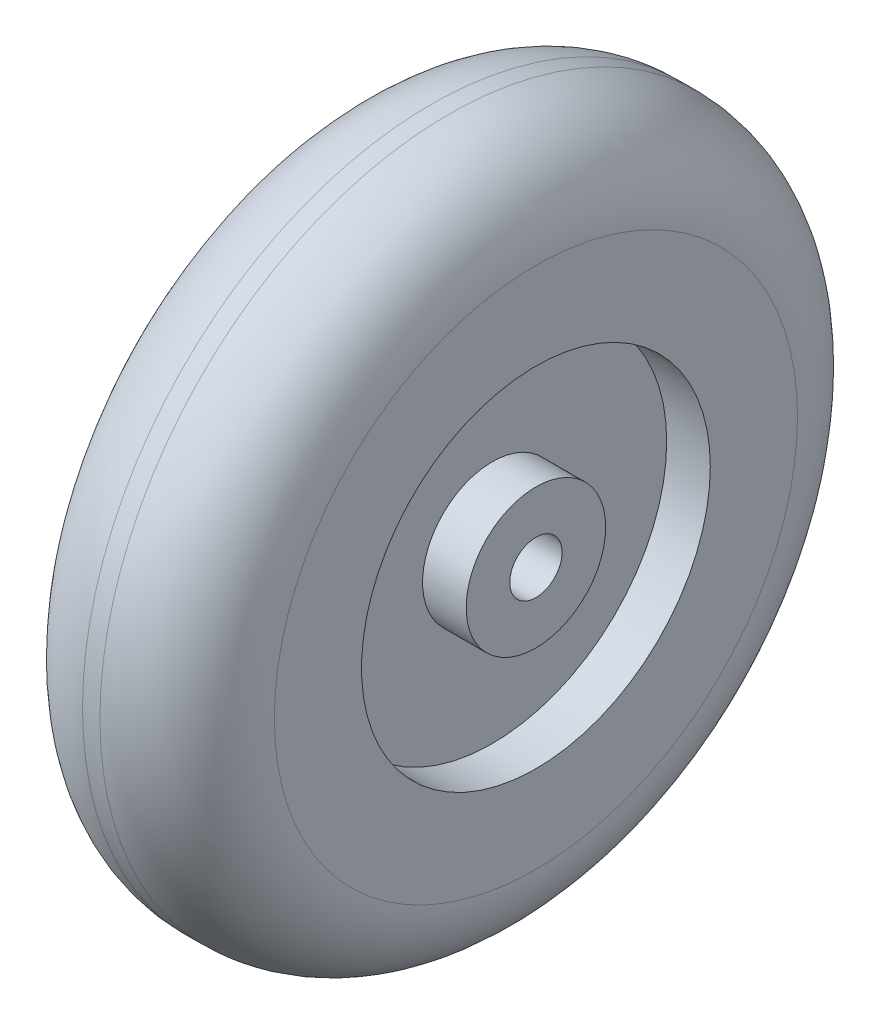
ISO-10303-21;
HEADER;
FILE_DESCRIPTION(('STEP AP214'),'2;1');
FILE_NAME('part.step','',(''),(''),'','','');
FILE_SCHEMA(('AUTOMOTIVE_DESIGN { 1 0 10303 214 1 1 1 1 }'));
ENDSEC;
DATA;
#1=APPLICATION_CONTEXT('core data for automotive mechanical design processes');
#2=APPLICATION_PROTOCOL_DEFINITION('international standard','automotive_design',2000,#1);
#3=PRODUCT_CONTEXT('',#1,'mechanical');
#4=PRODUCT('Part','Part','',(#3));
#5=PRODUCT_RELATED_PRODUCT_CATEGORY('part','',(#4));
#6=PRODUCT_DEFINITION_FORMATION('','',#4);
#7=PRODUCT_DEFINITION_CONTEXT('part definition',#1,'design');
#8=PRODUCT_DEFINITION('design','',#6,#7);
#9=PRODUCT_DEFINITION_SHAPE('','',#8);
#10=(LENGTH_UNIT() NAMED_UNIT(*) SI_UNIT(.MILLI.,.METRE.));
#11=(NAMED_UNIT(*) PLANE_ANGLE_UNIT() SI_UNIT($,.RADIAN.));
#12=(NAMED_UNIT(*) SI_UNIT($,.STERADIAN.) SOLID_ANGLE_UNIT());
#13=UNCERTAINTY_MEASURE_WITH_UNIT(LENGTH_MEASURE(1.E-05),#10,'distance_accuracy_value','');
#14=(GEOMETRIC_REPRESENTATION_CONTEXT(3) GLOBAL_UNCERTAINTY_ASSIGNED_CONTEXT((#13)) GLOBAL_UNIT_ASSIGNED_CONTEXT((#10,
#11,#12)) REPRESENTATION_CONTEXT('',''));
#15=CARTESIAN_POINT('',(0.,0.,0.));
#16=DIRECTION('',(0.,0.,1.));
#17=DIRECTION('',(1.,0.,0.));
#18=AXIS2_PLACEMENT_3D('',#15,#16,#17);
#19=CARTESIAN_POINT('',(-5.5,0.,0.));
#20=DIRECTION('',(1.,0.,0.));
#21=DIRECTION('',(0.,0.,-1.));
#22=AXIS2_PLACEMENT_3D('',#19,#20,#21);
#23=PLANE('',#22);
#24=CARTESIAN_POINT('',(-5.5,0.,0.));
#25=DIRECTION('',(1.,0.,0.));
#26=DIRECTION('',(0.,0.,-1.));
#27=AXIS2_PLACEMENT_3D('',#24,#25,#26);
#28=CIRCLE('',#27,1.5);
#29=CARTESIAN_POINT('',(-5.5,0.,-1.5));
#30=VERTEX_POINT('',#29);
#31=EDGE_CURVE('E56',#30,#30,#28,.T.);
#32=ORIENTED_EDGE('',*,*,#31,.T.);
#33=EDGE_LOOP('',(#32));
#34=FACE_BOUND('',#33,.T.);
#35=CARTESIAN_POINT('',(-5.5,0.,0.));
#36=DIRECTION('',(-1.,0.,0.));
#37=DIRECTION('',(0.,0.,1.));
#38=AXIS2_PLACEMENT_3D('',#35,#36,#37);
#39=CIRCLE('',#38,4.);
#40=CARTESIAN_POINT('',(-5.5,0.,4.));
#41=VERTEX_POINT('',#40);
#42=EDGE_CURVE('E80',#41,#41,#39,.T.);
#43=ORIENTED_EDGE('',*,*,#42,.T.);
#44=EDGE_LOOP('',(#43));
#45=FACE_BOUND('',#44,.T.);
#46=ADVANCED_FACE('F35',(#34,#45),#23,.F.);
#47=CARTESIAN_POINT('',(5.5,0.,0.));
#48=DIRECTION('',(1.,0.,0.));
#49=DIRECTION('',(0.,0.,-1.));
#50=AXIS2_PLACEMENT_3D('',#47,#48,#49);
#51=PLANE('',#50);
#52=CARTESIAN_POINT('',(5.5,0.,0.));
#53=DIRECTION('',(1.,0.,0.));
#54=DIRECTION('',(0.,0.,-1.));
#55=AXIS2_PLACEMENT_3D('',#52,#53,#54);
#56=CIRCLE('',#55,1.5);
#57=CARTESIAN_POINT('',(5.5,0.,-1.5));
#58=VERTEX_POINT('',#57);
#59=EDGE_CURVE('E55',#58,#58,#56,.T.);
#60=ORIENTED_EDGE('',*,*,#59,.F.);
#61=EDGE_LOOP('',(#60));
#62=FACE_BOUND('',#61,.T.);
#63=CARTESIAN_POINT('',(5.5,0.,0.));
#64=DIRECTION('',(1.,0.,0.));
#65=DIRECTION('',(0.,0.,-1.));
#66=AXIS2_PLACEMENT_3D('',#63,#64,#65);
#67=CIRCLE('',#66,4.);
#68=CARTESIAN_POINT('',(5.5,0.,-4.));
#69=VERTEX_POINT('',#68);
#70=EDGE_CURVE('E68',#69,#69,#67,.T.);
#71=ORIENTED_EDGE('',*,*,#70,.T.);
#72=EDGE_LOOP('',(#71));
#73=FACE_BOUND('',#72,.T.);
#74=ADVANCED_FACE('F114',(#62,#73),#51,.T.);
#75=CARTESIAN_POINT('',(5.5,0.,0.));
#76=DIRECTION('',(1.,0.,0.));
#77=DIRECTION('',(0.,0.,-1.));
#78=AXIS2_PLACEMENT_3D('',#75,#76,#77);
#79=CIRCLE('',#78,10.);
#80=CARTESIAN_POINT('',(5.5,0.,-10.));
#81=VERTEX_POINT('',#80);
#82=EDGE_CURVE('E62',#81,#81,#79,.T.);
#83=ORIENTED_EDGE('',*,*,#82,.F.);
#84=EDGE_LOOP('',(#83));
#85=FACE_BOUND('',#84,.T.);
#86=CARTESIAN_POINT('',(5.5,0.,0.));
#87=DIRECTION('',(1.,0.,0.));
#88=DIRECTION('',(0.,0.,-1.));
#89=AXIS2_PLACEMENT_3D('',#86,#87,#88);
#90=CIRCLE('',#89,15.);
#91=CARTESIAN_POINT('',(5.5,0.,-15.));
#92=VERTEX_POINT('',#91);
#93=EDGE_CURVE('E10',#92,#92,#90,.T.);
#94=ORIENTED_EDGE('',*,*,#93,.T.);
#95=EDGE_LOOP('',(#94));
#96=FACE_BOUND('',#95,.T.);
#97=ADVANCED_FACE('F105',(#85,#96),#51,.T.);
#98=CARTESIAN_POINT('',(-5.5,0.,0.));
#99=DIRECTION('',(-1.,0.,0.));
#100=DIRECTION('',(0.,0.,1.));
#101=AXIS2_PLACEMENT_3D('',#98,#99,#100);
#102=CIRCLE('',#101,10.);
#103=CARTESIAN_POINT('',(-5.5,0.,10.));
#104=VERTEX_POINT('',#103);
#105=EDGE_CURVE('E74',#104,#104,#102,.T.);
#106=ORIENTED_EDGE('',*,*,#105,.F.);
#107=EDGE_LOOP('',(#106));
#108=FACE_BOUND('',#107,.T.);
#109=CARTESIAN_POINT('',(-5.5,0.,0.));
#110=DIRECTION('',(1.,0.,0.));
#111=DIRECTION('',(0.,0.,-1.));
#112=AXIS2_PLACEMENT_3D('',#109,#110,#111);
#113=CIRCLE('',#112,15.);
#114=CARTESIAN_POINT('',(-5.5,0.,-15.));
#115=VERTEX_POINT('',#114);
#116=EDGE_CURVE('E42',#115,#115,#113,.F.);
#117=ORIENTED_EDGE('',*,*,#116,.T.);
#118=EDGE_LOOP('',(#117));
#119=FACE_BOUND('',#118,.T.);
#120=ADVANCED_FACE('F102',(#108,#119),#23,.F.);
#121=CARTESIAN_POINT('',(5.5,0.,0.));
#122=DIRECTION('',(-1.,0.,0.));
#123=DIRECTION('',(0.,0.,1.));
#124=AXIS2_PLACEMENT_3D('',#121,#122,#123);
#125=CYLINDRICAL_SURFACE('',#124,20.);
#126=CARTESIAN_POINT('',(-0.5,0.,0.));
#127=DIRECTION('',(1.,0.,0.));
#128=DIRECTION('',(0.,0.,-1.));
#129=AXIS2_PLACEMENT_3D('',#126,#127,#128);
#130=CIRCLE('',#129,20.);
#131=CARTESIAN_POINT('',(-0.5,0.,-20.));
#132=VERTEX_POINT('',#131);
#133=EDGE_CURVE('E46',#132,#132,#130,.T.);
#134=ORIENTED_EDGE('',*,*,#133,.T.);
#135=EDGE_LOOP('',(#134));
#136=FACE_BOUND('',#135,.T.);
#137=CARTESIAN_POINT('',(0.5,0.,0.));
#138=DIRECTION('',(1.,0.,0.));
#139=DIRECTION('',(0.,0.,-1.));
#140=AXIS2_PLACEMENT_3D('',#137,#138,#139);
#141=CIRCLE('',#140,20.);
#142=CARTESIAN_POINT('',(0.5,0.,-20.));
#143=VERTEX_POINT('',#142);
#144=EDGE_CURVE('E50',#143,#143,#141,.F.);
#145=ORIENTED_EDGE('',*,*,#144,.T.);
#146=EDGE_LOOP('',(#145));
#147=FACE_BOUND('',#146,.T.);
#148=ADVANCED_FACE('F104',(#136,#147),#125,.T.);
#149=CARTESIAN_POINT('',(5.5,0.,0.));
#150=DIRECTION('',(-1.,0.,0.));
#151=DIRECTION('',(0.,0.,1.));
#152=AXIS2_PLACEMENT_3D('',#149,#150,#151);
#153=CYLINDRICAL_SURFACE('',#152,1.5);
#154=ORIENTED_EDGE('',*,*,#59,.T.);
#155=EDGE_LOOP('',(#154));
#156=FACE_BOUND('',#155,.T.);
#157=ORIENTED_EDGE('',*,*,#31,.F.);
#158=EDGE_LOOP('',(#157));
#159=FACE_BOUND('',#158,.T.);
#160=ADVANCED_FACE('F111',(#156,#159),#153,.F.);
#161=CARTESIAN_POINT('',(-0.5,0.,0.));
#162=DIRECTION('',(1.,0.,0.));
#163=DIRECTION('',(0.,0.,-1.));
#164=AXIS2_PLACEMENT_3D('',#161,#162,#163);
#165=TOROIDAL_SURFACE('',#164,15.,5.);
#166=ORIENTED_EDGE('',*,*,#116,.F.);
#167=EDGE_LOOP('',(#166));
#168=FACE_BOUND('',#167,.T.);
#169=ORIENTED_EDGE('',*,*,#133,.F.);
#170=EDGE_LOOP('',(#169));
#171=FACE_BOUND('',#170,.T.);
#172=ADVANCED_FACE('F143',(#168,#171),#165,.T.);
#173=CARTESIAN_POINT('',(0.5,0.,0.));
#174=DIRECTION('',(1.,0.,0.));
#175=DIRECTION('',(0.,0.,-1.));
#176=AXIS2_PLACEMENT_3D('',#173,#174,#175);
#177=TOROIDAL_SURFACE('',#176,15.,5.);
#178=ORIENTED_EDGE('',*,*,#144,.F.);
#179=EDGE_LOOP('',(#178));
#180=FACE_BOUND('',#179,.T.);
#181=ORIENTED_EDGE('',*,*,#93,.F.);
#182=EDGE_LOOP('',(#181));
#183=FACE_BOUND('',#182,.T.);
#184=ADVANCED_FACE('F37',(#180,#183),#177,.T.);
#185=CARTESIAN_POINT('',(3.,0.,0.));
#186=DIRECTION('',(1.,0.,0.));
#187=DIRECTION('',(0.,0.,-1.));
#188=AXIS2_PLACEMENT_3D('',#185,#186,#187);
#189=CYLINDRICAL_SURFACE('',#188,10.);
#190=CARTESIAN_POINT('',(3.,0.,0.));
#191=DIRECTION('',(1.,0.,0.));
#192=DIRECTION('',(0.,0.,-1.));
#193=AXIS2_PLACEMENT_3D('',#190,#191,#192);
#194=CIRCLE('',#193,10.);
#195=CARTESIAN_POINT('',(3.,0.,-10.));
#196=VERTEX_POINT('',#195);
#197=EDGE_CURVE('E59',#196,#196,#194,.T.);
#198=ORIENTED_EDGE('',*,*,#197,.F.);
#199=EDGE_LOOP('',(#198));
#200=FACE_BOUND('',#199,.T.);
#201=ORIENTED_EDGE('',*,*,#82,.T.);
#202=EDGE_LOOP('',(#201));
#203=FACE_BOUND('',#202,.T.);
#204=ADVANCED_FACE('F137',(#200,#203),#189,.F.);
#205=CARTESIAN_POINT('',(3.,0.,0.));
#206=DIRECTION('',(1.,0.,0.));
#207=DIRECTION('',(0.,0.,-1.));
#208=AXIS2_PLACEMENT_3D('',#205,#206,#207);
#209=PLANE('',#208);
#210=CARTESIAN_POINT('',(3.,0.,0.));
#211=DIRECTION('',(1.,0.,0.));
#212=DIRECTION('',(0.,0.,-1.));
#213=AXIS2_PLACEMENT_3D('',#210,#211,#212);
#214=CIRCLE('',#213,4.);
#215=CARTESIAN_POINT('',(3.,0.,-4.));
#216=VERTEX_POINT('',#215);
#217=EDGE_CURVE('E65',#216,#216,#214,.T.);
#218=ORIENTED_EDGE('',*,*,#217,.F.);
#219=EDGE_LOOP('',(#218));
#220=FACE_BOUND('',#219,.T.);
#221=ORIENTED_EDGE('',*,*,#197,.T.);
#222=EDGE_LOOP('',(#221));
#223=FACE_BOUND('',#222,.T.);
#224=ADVANCED_FACE('F133',(#220,#223),#209,.T.);
#225=CARTESIAN_POINT('',(3.,0.,0.));
#226=DIRECTION('',(1.,0.,0.));
#227=DIRECTION('',(0.,0.,-1.));
#228=AXIS2_PLACEMENT_3D('',#225,#226,#227);
#229=CYLINDRICAL_SURFACE('',#228,4.);
#230=ORIENTED_EDGE('',*,*,#217,.T.);
#231=EDGE_LOOP('',(#230));
#232=FACE_BOUND('',#231,.T.);
#233=ORIENTED_EDGE('',*,*,#70,.F.);
#234=EDGE_LOOP('',(#233));
#235=FACE_BOUND('',#234,.T.);
#236=ADVANCED_FACE('F98',(#232,#235),#229,.T.);
#237=CARTESIAN_POINT('',(-3.,0.,0.));
#238=DIRECTION('',(-1.,0.,0.));
#239=DIRECTION('',(0.,0.,1.));
#240=AXIS2_PLACEMENT_3D('',#237,#238,#239);
#241=CYLINDRICAL_SURFACE('',#240,10.);
#242=CARTESIAN_POINT('',(-3.,0.,0.));
#243=DIRECTION('',(-1.,0.,0.));
#244=DIRECTION('',(0.,0.,1.));
#245=AXIS2_PLACEMENT_3D('',#242,#243,#244);
#246=CIRCLE('',#245,10.);
#247=CARTESIAN_POINT('',(-3.,0.,10.));
#248=VERTEX_POINT('',#247);
#249=EDGE_CURVE('E71',#248,#248,#246,.T.);
#250=ORIENTED_EDGE('',*,*,#249,.F.);
#251=EDGE_LOOP('',(#250));
#252=FACE_BOUND('',#251,.T.);
#253=ORIENTED_EDGE('',*,*,#105,.T.);
#254=EDGE_LOOP('',(#253));
#255=FACE_BOUND('',#254,.T.);
#256=ADVANCED_FACE('F92',(#252,#255),#241,.F.);
#257=CARTESIAN_POINT('',(-3.,0.,0.));
#258=DIRECTION('',(-1.,0.,0.));
#259=DIRECTION('',(0.,0.,1.));
#260=AXIS2_PLACEMENT_3D('',#257,#258,#259);
#261=PLANE('',#260);
#262=CARTESIAN_POINT('',(-3.,0.,0.));
#263=DIRECTION('',(-1.,0.,0.));
#264=DIRECTION('',(0.,0.,1.));
#265=AXIS2_PLACEMENT_3D('',#262,#263,#264);
#266=CIRCLE('',#265,4.);
#267=CARTESIAN_POINT('',(-3.,0.,4.));
#268=VERTEX_POINT('',#267);
#269=EDGE_CURVE('E77',#268,#268,#266,.T.);
#270=ORIENTED_EDGE('',*,*,#269,.F.);
#271=EDGE_LOOP('',(#270));
#272=FACE_BOUND('',#271,.T.);
#273=ORIENTED_EDGE('',*,*,#249,.T.);
#274=EDGE_LOOP('',(#273));
#275=FACE_BOUND('',#274,.T.);
#276=ADVANCED_FACE('F89',(#272,#275),#261,.T.);
#277=CARTESIAN_POINT('',(-3.,0.,0.));
#278=DIRECTION('',(-1.,0.,0.));
#279=DIRECTION('',(0.,0.,1.));
#280=AXIS2_PLACEMENT_3D('',#277,#278,#279);
#281=CYLINDRICAL_SURFACE('',#280,4.);
#282=ORIENTED_EDGE('',*,*,#269,.T.);
#283=EDGE_LOOP('',(#282));
#284=FACE_BOUND('',#283,.T.);
#285=ORIENTED_EDGE('',*,*,#42,.F.);
#286=EDGE_LOOP('',(#285));
#287=FACE_BOUND('',#286,.T.);
#288=ADVANCED_FACE('F86',(#284,#287),#281,.T.);
#289=CLOSED_SHELL('',(#46,#74,#97,#120,#148,#160,#172,#184,#204,#224,#236,#256,#276,#288));
#290=MANIFOLD_SOLID_BREP('B2',#289);
#291=ADVANCED_BREP_SHAPE_REPRESENTATION('',(#18,#290),#14);
#292=SHAPE_DEFINITION_REPRESENTATION(#9,#291);
ENDSEC;
END-ISO-10303-21;
